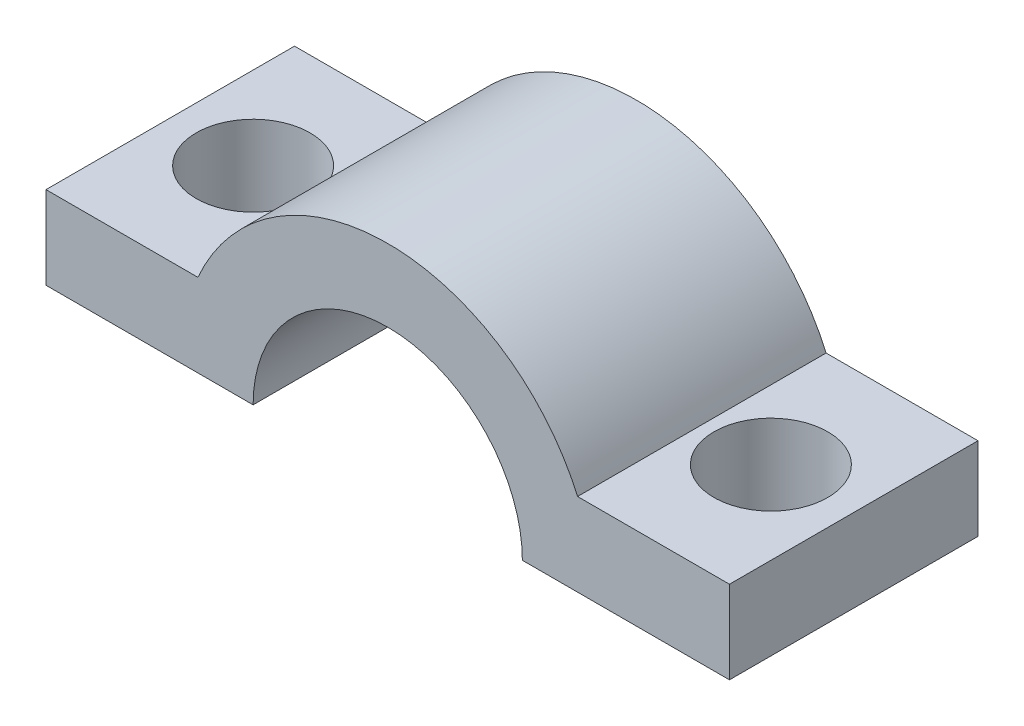
ISO-10303-21;
HEADER;
FILE_DESCRIPTION(('STEP AP214'),'2;1');
FILE_NAME('part.step','',(''),(''),'','','');
FILE_SCHEMA(('AUTOMOTIVE_DESIGN { 1 0 10303 214 1 1 1 1 }'));
ENDSEC;
DATA;
#1=APPLICATION_CONTEXT('core data for automotive mechanical design processes');
#2=APPLICATION_PROTOCOL_DEFINITION('international standard','automotive_design',2000,#1);
#3=PRODUCT_CONTEXT('',#1,'mechanical');
#4=PRODUCT('Part','Part','',(#3));
#5=PRODUCT_RELATED_PRODUCT_CATEGORY('part','',(#4));
#6=PRODUCT_DEFINITION_FORMATION('','',#4);
#7=PRODUCT_DEFINITION_CONTEXT('part definition',#1,'design');
#8=PRODUCT_DEFINITION('design','',#6,#7);
#9=PRODUCT_DEFINITION_SHAPE('','',#8);
#10=(LENGTH_UNIT() NAMED_UNIT(*) SI_UNIT(.MILLI.,.METRE.));
#11=(NAMED_UNIT(*) PLANE_ANGLE_UNIT() SI_UNIT($,.RADIAN.));
#12=(NAMED_UNIT(*) SI_UNIT($,.STERADIAN.) SOLID_ANGLE_UNIT());
#13=UNCERTAINTY_MEASURE_WITH_UNIT(LENGTH_MEASURE(1.E-05),#10,'distance_accuracy_value','');
#14=(GEOMETRIC_REPRESENTATION_CONTEXT(3) GLOBAL_UNCERTAINTY_ASSIGNED_CONTEXT((#13)) GLOBAL_UNIT_ASSIGNED_CONTEXT((#10,
#11,#12)) REPRESENTATION_CONTEXT('',''));
#15=CARTESIAN_POINT('',(0.,0.,0.));
#16=DIRECTION('',(0.,0.,1.));
#17=DIRECTION('',(1.,0.,0.));
#18=AXIS2_PLACEMENT_3D('',#15,#16,#17);
#19=CARTESIAN_POINT('',(0.,0.,12.));
#20=DIRECTION('',(0.,0.,-1.));
#21=DIRECTION('',(-1.,0.,0.));
#22=AXIS2_PLACEMENT_3D('',#19,#20,#21);
#23=CYLINDRICAL_SURFACE('',#22,13.);
#24=CARTESIAN_POINT('',(0.,0.,-12.));
#25=DIRECTION('',(0.,0.,-1.));
#26=DIRECTION('',(1.,0.,0.));
#27=AXIS2_PLACEMENT_3D('',#24,#25,#26);
#28=CIRCLE('',#27,13.);
#29=CARTESIAN_POINT('',(-13.,0.,-12.));
#30=VERTEX_POINT('',#29);
#31=CARTESIAN_POINT('',(13.,0.,-12.));
#32=VERTEX_POINT('',#31);
#33=EDGE_CURVE('E146',#30,#32,#28,.T.);
#34=ORIENTED_EDGE('',*,*,#33,.T.);
#35=DIRECTION('',(0.,0.,-1.));
#36=VECTOR('',#35,1.);
#37=CARTESIAN_POINT('',(13.,0.,12.));
#38=LINE('',#37,#36);
#39=CARTESIAN_POINT('',(13.,0.,12.));
#40=VERTEX_POINT('',#39);
#41=EDGE_CURVE('E11',#40,#32,#38,.T.);
#42=ORIENTED_EDGE('',*,*,#41,.F.);
#43=CARTESIAN_POINT('',(0.,0.,12.));
#44=DIRECTION('',(0.,0.,-1.));
#45=DIRECTION('',(1.,0.,0.));
#46=AXIS2_PLACEMENT_3D('',#43,#44,#45);
#47=CIRCLE('',#46,13.);
#48=CARTESIAN_POINT('',(-13.,0.,12.));
#49=VERTEX_POINT('',#48);
#50=EDGE_CURVE('E169',#49,#40,#47,.T.);
#51=ORIENTED_EDGE('',*,*,#50,.F.);
#52=DIRECTION('',(0.,0.,-1.));
#53=VECTOR('',#52,1.);
#54=CARTESIAN_POINT('',(-13.,0.,12.));
#55=LINE('',#54,#53);
#56=EDGE_CURVE('E142',#49,#30,#55,.T.);
#57=ORIENTED_EDGE('',*,*,#56,.T.);
#58=EDGE_LOOP('',(#34,#42,#51,#57));
#59=FACE_BOUND('',#58,.T.);
#60=ADVANCED_FACE('F45',(#59),#23,.F.);
#61=CARTESIAN_POINT('',(13.,0.,12.));
#62=DIRECTION('',(0.,1.,0.));
#63=DIRECTION('',(0.,0.,1.));
#64=AXIS2_PLACEMENT_3D('',#61,#62,#63);
#65=PLANE('',#64);
#66=CARTESIAN_POINT('',(25.,-4.38885039422132E-13,0.));
#67=DIRECTION('',(0.,1.,0.));
#68=DIRECTION('',(-1.,0.,0.));
#69=AXIS2_PLACEMENT_3D('',#66,#67,#68);
#70=CIRCLE('',#69,5.5);
#71=CARTESIAN_POINT('',(19.5,-3.97260276867116E-13,0.));
#72=VERTEX_POINT('',#71);
#73=EDGE_CURVE('E151',#72,#72,#70,.T.);
#74=ORIENTED_EDGE('',*,*,#73,.T.);
#75=EDGE_LOOP('',(#74));
#76=FACE_BOUND('',#75,.T.);
#77=DIRECTION('',(1.,0.,0.));
#78=VECTOR('',#77,1.);
#79=CARTESIAN_POINT('',(13.,0.,-12.));
#80=LINE('',#79,#78);
#81=CARTESIAN_POINT('',(33.,0.,-12.));
#82=VERTEX_POINT('',#81);
#83=EDGE_CURVE('E150',#32,#82,#80,.T.);
#84=ORIENTED_EDGE('',*,*,#83,.T.);
#85=DIRECTION('',(0.,0.,-1.));
#86=VECTOR('',#85,1.);
#87=CARTESIAN_POINT('',(33.,0.,12.));
#88=LINE('',#87,#86);
#89=CARTESIAN_POINT('',(33.,0.,12.));
#90=VERTEX_POINT('',#89);
#91=EDGE_CURVE('E54',#90,#82,#88,.T.);
#92=ORIENTED_EDGE('',*,*,#91,.F.);
#93=DIRECTION('',(1.,0.,0.));
#94=VECTOR('',#93,1.);
#95=CARTESIAN_POINT('',(13.,0.,12.));
#96=LINE('',#95,#94);
#97=EDGE_CURVE('E105',#40,#90,#96,.T.);
#98=ORIENTED_EDGE('',*,*,#97,.F.);
#99=ORIENTED_EDGE('',*,*,#41,.T.);
#100=EDGE_LOOP('',(#84,#92,#98,#99));
#101=FACE_BOUND('',#100,.T.);
#102=ADVANCED_FACE('F229',(#76,#101),#65,.F.);
#103=CARTESIAN_POINT('',(33.,0.,12.));
#104=DIRECTION('',(-1.,0.,0.));
#105=DIRECTION('',(0.,0.,1.));
#106=AXIS2_PLACEMENT_3D('',#103,#104,#105);
#107=PLANE('',#106);
#108=DIRECTION('',(0.,1.,0.));
#109=VECTOR('',#108,1.);
#110=CARTESIAN_POINT('',(33.,0.,-12.));
#111=LINE('',#110,#109);
#112=CARTESIAN_POINT('',(33.,8.,-12.));
#113=VERTEX_POINT('',#112);
#114=EDGE_CURVE('E154',#82,#113,#111,.T.);
#115=ORIENTED_EDGE('',*,*,#114,.T.);
#116=DIRECTION('',(0.,0.,-1.));
#117=VECTOR('',#116,1.);
#118=CARTESIAN_POINT('',(33.,8.,12.));
#119=LINE('',#118,#117);
#120=CARTESIAN_POINT('',(33.,8.,12.));
#121=VERTEX_POINT('',#120);
#122=EDGE_CURVE('E180',#121,#113,#119,.T.);
#123=ORIENTED_EDGE('',*,*,#122,.F.);
#124=DIRECTION('',(0.,1.,0.));
#125=VECTOR('',#124,1.);
#126=CARTESIAN_POINT('',(33.,0.,12.));
#127=LINE('',#126,#125);
#128=EDGE_CURVE('E190',#90,#121,#127,.T.);
#129=ORIENTED_EDGE('',*,*,#128,.F.);
#130=ORIENTED_EDGE('',*,*,#91,.T.);
#131=EDGE_LOOP('',(#115,#123,#129,#130));
#132=FACE_BOUND('',#131,.T.);
#133=ADVANCED_FACE('F188',(#132),#107,.F.);
#134=CARTESIAN_POINT('',(18.3303027798234,8.,12.));
#135=DIRECTION('',(0.,-1.,0.));
#136=DIRECTION('',(0.,0.,-1.));
#137=AXIS2_PLACEMENT_3D('',#134,#135,#136);
#138=PLANE('',#137);
#139=CARTESIAN_POINT('',(25.0000000000001,7.99999999999956,0.));
#140=DIRECTION('',(0.,1.,0.));
#141=DIRECTION('',(-1.,0.,0.));
#142=AXIS2_PLACEMENT_3D('',#139,#140,#141);
#143=CIRCLE('',#142,5.5);
#144=CARTESIAN_POINT('',(19.5000000000001,7.9999999999996,0.));
#145=VERTEX_POINT('',#144);
#146=EDGE_CURVE('E221',#145,#145,#143,.T.);
#147=ORIENTED_EDGE('',*,*,#146,.F.);
#148=EDGE_LOOP('',(#147));
#149=FACE_BOUND('',#148,.T.);
#150=DIRECTION('',(-1.,0.,0.));
#151=VECTOR('',#150,1.);
#152=CARTESIAN_POINT('',(18.3303027798234,8.,-12.));
#153=LINE('',#152,#151);
#154=CARTESIAN_POINT('',(18.3303027798234,8.,-12.));
#155=VERTEX_POINT('',#154);
#156=EDGE_CURVE('E157',#113,#155,#153,.T.);
#157=ORIENTED_EDGE('',*,*,#156,.T.);
#158=DIRECTION('',(0.,0.,-1.));
#159=VECTOR('',#158,1.);
#160=CARTESIAN_POINT('',(18.3303027798234,8.,12.));
#161=LINE('',#160,#159);
#162=CARTESIAN_POINT('',(18.3303027798234,8.,12.));
#163=VERTEX_POINT('',#162);
#164=EDGE_CURVE('E176',#163,#155,#161,.T.);
#165=ORIENTED_EDGE('',*,*,#164,.F.);
#166=DIRECTION('',(-1.,0.,0.));
#167=VECTOR('',#166,1.);
#168=CARTESIAN_POINT('',(18.3303027798234,8.,12.));
#169=LINE('',#168,#167);
#170=EDGE_CURVE('E203',#121,#163,#169,.T.);
#171=ORIENTED_EDGE('',*,*,#170,.F.);
#172=ORIENTED_EDGE('',*,*,#122,.T.);
#173=EDGE_LOOP('',(#157,#165,#171,#172));
#174=FACE_BOUND('',#173,.T.);
#175=ADVANCED_FACE('F198',(#149,#174),#138,.F.);
#176=CARTESIAN_POINT('',(0.,0.,12.));
#177=DIRECTION('',(0.,0.,-1.));
#178=DIRECTION('',(-1.,0.,0.));
#179=AXIS2_PLACEMENT_3D('',#176,#177,#178);
#180=CYLINDRICAL_SURFACE('',#179,20.);
#181=CARTESIAN_POINT('',(0.,0.,-12.));
#182=DIRECTION('',(0.,0.,1.));
#183=DIRECTION('',(1.,0.,0.));
#184=AXIS2_PLACEMENT_3D('',#181,#182,#183);
#185=CIRCLE('',#184,20.);
#186=CARTESIAN_POINT('',(-18.3303027798234,7.99999999999989,-12.));
#187=VERTEX_POINT('',#186);
#188=EDGE_CURVE('E160',#155,#187,#185,.T.);
#189=ORIENTED_EDGE('',*,*,#188,.T.);
#190=DIRECTION('',(0.,0.,-1.));
#191=VECTOR('',#190,1.);
#192=CARTESIAN_POINT('',(-18.3303027798234,7.99999999999989,12.));
#193=LINE('',#192,#191);
#194=CARTESIAN_POINT('',(-18.3303027798234,7.99999999999989,12.));
#195=VERTEX_POINT('',#194);
#196=EDGE_CURVE('E135',#195,#187,#193,.T.);
#197=ORIENTED_EDGE('',*,*,#196,.F.);
#198=CARTESIAN_POINT('',(0.,0.,12.));
#199=DIRECTION('',(0.,0.,1.));
#200=DIRECTION('',(1.,0.,0.));
#201=AXIS2_PLACEMENT_3D('',#198,#199,#200);
#202=CIRCLE('',#201,20.);
#203=EDGE_CURVE('E124',#163,#195,#202,.T.);
#204=ORIENTED_EDGE('',*,*,#203,.F.);
#205=ORIENTED_EDGE('',*,*,#164,.T.);
#206=EDGE_LOOP('',(#189,#197,#204,#205));
#207=FACE_BOUND('',#206,.T.);
#208=ADVANCED_FACE('F201',(#207),#180,.T.);
#209=CARTESIAN_POINT('',(-18.3303027798234,7.99999999999989,12.));
#210=DIRECTION('',(0.,-1.,0.));
#211=DIRECTION('',(1.,0.,0.));
#212=AXIS2_PLACEMENT_3D('',#209,#210,#211);
#213=PLANE('',#212);
#214=CARTESIAN_POINT('',(-24.9999999999999,7.99999999999994,0.));
#215=DIRECTION('',(0.,1.,0.));
#216=DIRECTION('',(1.,0.,0.));
#217=AXIS2_PLACEMENT_3D('',#214,#215,#216);
#218=CIRCLE('',#217,5.50000000000007);
#219=CARTESIAN_POINT('',(-19.4999999999999,7.9999999999999,0.));
#220=VERTEX_POINT('',#219);
#221=EDGE_CURVE('E217',#220,#220,#218,.T.);
#222=ORIENTED_EDGE('',*,*,#221,.F.);
#223=EDGE_LOOP('',(#222));
#224=FACE_BOUND('',#223,.T.);
#225=DIRECTION('',(-1.,0.,0.));
#226=VECTOR('',#225,1.);
#227=CARTESIAN_POINT('',(-18.3303027798234,7.99999999999989,-12.));
#228=LINE('',#227,#226);
#229=CARTESIAN_POINT('',(-33.,8.,-12.));
#230=VERTEX_POINT('',#229);
#231=EDGE_CURVE('E133',#187,#230,#228,.T.);
#232=ORIENTED_EDGE('',*,*,#231,.T.);
#233=DIRECTION('',(0.,0.,-1.));
#234=VECTOR('',#233,1.);
#235=CARTESIAN_POINT('',(-33.,8.,12.));
#236=LINE('',#235,#234);
#237=CARTESIAN_POINT('',(-33.,8.,12.));
#238=VERTEX_POINT('',#237);
#239=EDGE_CURVE('E130',#238,#230,#236,.T.);
#240=ORIENTED_EDGE('',*,*,#239,.F.);
#241=DIRECTION('',(-1.,0.,0.));
#242=VECTOR('',#241,1.);
#243=CARTESIAN_POINT('',(-18.3303027798234,7.99999999999989,12.));
#244=LINE('',#243,#242);
#245=EDGE_CURVE('E118',#195,#238,#244,.T.);
#246=ORIENTED_EDGE('',*,*,#245,.F.);
#247=ORIENTED_EDGE('',*,*,#196,.T.);
#248=EDGE_LOOP('',(#232,#240,#246,#247));
#249=FACE_BOUND('',#248,.T.);
#250=ADVANCED_FACE('F131',(#224,#249),#213,.F.);
#251=CARTESIAN_POINT('',(-33.,0.,12.));
#252=DIRECTION('',(1.,0.,0.));
#253=DIRECTION('',(0.,0.,-1.));
#254=AXIS2_PLACEMENT_3D('',#251,#252,#253);
#255=PLANE('',#254);
#256=DIRECTION('',(0.,-1.,0.));
#257=VECTOR('',#256,1.);
#258=CARTESIAN_POINT('',(-33.,0.,-12.));
#259=LINE('',#258,#257);
#260=CARTESIAN_POINT('',(-33.,0.,-12.));
#261=VERTEX_POINT('',#260);
#262=EDGE_CURVE('E91',#230,#261,#259,.T.);
#263=ORIENTED_EDGE('',*,*,#262,.T.);
#264=DIRECTION('',(0.,0.,-1.));
#265=VECTOR('',#264,1.);
#266=CARTESIAN_POINT('',(-33.,0.,12.));
#267=LINE('',#266,#265);
#268=CARTESIAN_POINT('',(-33.,0.,12.));
#269=VERTEX_POINT('',#268);
#270=EDGE_CURVE('E136',#269,#261,#267,.T.);
#271=ORIENTED_EDGE('',*,*,#270,.F.);
#272=DIRECTION('',(0.,-1.,0.));
#273=VECTOR('',#272,1.);
#274=CARTESIAN_POINT('',(-33.,0.,12.));
#275=LINE('',#274,#273);
#276=EDGE_CURVE('E122',#238,#269,#275,.T.);
#277=ORIENTED_EDGE('',*,*,#276,.F.);
#278=ORIENTED_EDGE('',*,*,#239,.T.);
#279=EDGE_LOOP('',(#263,#271,#277,#278));
#280=FACE_BOUND('',#279,.T.);
#281=ADVANCED_FACE('F138',(#280),#255,.F.);
#282=CARTESIAN_POINT('',(-13.,0.,12.));
#283=DIRECTION('',(0.,1.,0.));
#284=DIRECTION('',(0.,0.,1.));
#285=AXIS2_PLACEMENT_3D('',#282,#283,#284);
#286=PLANE('',#285);
#287=CARTESIAN_POINT('',(-25.,0.,0.));
#288=DIRECTION('',(0.,1.,0.));
#289=DIRECTION('',(1.,0.,0.));
#290=AXIS2_PLACEMENT_3D('',#287,#288,#289);
#291=CIRCLE('',#290,5.50000000000007);
#292=CARTESIAN_POINT('',(-19.4999999999999,-1.02340084214205E-13,0.));
#293=VERTEX_POINT('',#292);
#294=EDGE_CURVE('E213',#293,#293,#291,.T.);
#295=ORIENTED_EDGE('',*,*,#294,.T.);
#296=EDGE_LOOP('',(#295));
#297=FACE_BOUND('',#296,.T.);
#298=DIRECTION('',(1.,0.,0.));
#299=VECTOR('',#298,1.);
#300=CARTESIAN_POINT('',(-13.,0.,-12.));
#301=LINE('',#300,#299);
#302=EDGE_CURVE('E97',#261,#30,#301,.T.);
#303=ORIENTED_EDGE('',*,*,#302,.T.);
#304=ORIENTED_EDGE('',*,*,#56,.F.);
#305=DIRECTION('',(1.,0.,0.));
#306=VECTOR('',#305,1.);
#307=CARTESIAN_POINT('',(-13.,0.,12.));
#308=LINE('',#307,#306);
#309=EDGE_CURVE('E62',#269,#49,#308,.T.);
#310=ORIENTED_EDGE('',*,*,#309,.F.);
#311=ORIENTED_EDGE('',*,*,#270,.T.);
#312=EDGE_LOOP('',(#303,#304,#310,#311));
#313=FACE_BOUND('',#312,.T.);
#314=ADVANCED_FACE('F254',(#297,#313),#286,.F.);
#315=CARTESIAN_POINT('',(0.,0.,12.));
#316=DIRECTION('',(0.,0.,1.));
#317=DIRECTION('',(1.,0.,0.));
#318=AXIS2_PLACEMENT_3D('',#315,#316,#317);
#319=PLANE('',#318);
#320=ORIENTED_EDGE('',*,*,#50,.T.);
#321=ORIENTED_EDGE('',*,*,#97,.T.);
#322=ORIENTED_EDGE('',*,*,#128,.T.);
#323=ORIENTED_EDGE('',*,*,#170,.T.);
#324=ORIENTED_EDGE('',*,*,#203,.T.);
#325=ORIENTED_EDGE('',*,*,#245,.T.);
#326=ORIENTED_EDGE('',*,*,#276,.T.);
#327=ORIENTED_EDGE('',*,*,#309,.T.);
#328=EDGE_LOOP('',(#320,#321,#322,#323,#324,#325,#326,#327));
#329=FACE_BOUND('',#328,.T.);
#330=ADVANCED_FACE('F120',(#329),#319,.T.);
#331=CARTESIAN_POINT('',(0.,0.,-12.));
#332=DIRECTION('',(0.,0.,1.));
#333=DIRECTION('',(1.,0.,0.));
#334=AXIS2_PLACEMENT_3D('',#331,#332,#333);
#335=PLANE('',#334);
#336=ORIENTED_EDGE('',*,*,#33,.F.);
#337=ORIENTED_EDGE('',*,*,#302,.F.);
#338=ORIENTED_EDGE('',*,*,#262,.F.);
#339=ORIENTED_EDGE('',*,*,#231,.F.);
#340=ORIENTED_EDGE('',*,*,#188,.F.);
#341=ORIENTED_EDGE('',*,*,#156,.F.);
#342=ORIENTED_EDGE('',*,*,#114,.F.);
#343=ORIENTED_EDGE('',*,*,#83,.F.);
#344=EDGE_LOOP('',(#336,#337,#338,#339,#340,#341,#342,#343));
#345=FACE_BOUND('',#344,.T.);
#346=ADVANCED_FACE('F194',(#345),#335,.F.);
#347=CARTESIAN_POINT('',(-25.,0.,0.));
#348=DIRECTION('',(0.,1.,0.));
#349=DIRECTION('',(-1.,0.,0.));
#350=AXIS2_PLACEMENT_3D('',#347,#348,#349);
#351=CYLINDRICAL_SURFACE('',#350,5.50000000000007);
#352=ORIENTED_EDGE('',*,*,#294,.F.);
#353=EDGE_LOOP('',(#352));
#354=FACE_BOUND('',#353,.T.);
#355=ORIENTED_EDGE('',*,*,#221,.T.);
#356=EDGE_LOOP('',(#355));
#357=FACE_BOUND('',#356,.T.);
#358=ADVANCED_FACE('F234',(#354,#357),#351,.F.);
#359=CARTESIAN_POINT('',(25.,-4.38885039422132E-13,0.));
#360=DIRECTION('',(0.,1.,0.));
#361=DIRECTION('',(-1.,0.,0.));
#362=AXIS2_PLACEMENT_3D('',#359,#360,#361);
#363=CYLINDRICAL_SURFACE('',#362,5.5);
#364=ORIENTED_EDGE('',*,*,#73,.F.);
#365=EDGE_LOOP('',(#364));
#366=FACE_BOUND('',#365,.T.);
#367=ORIENTED_EDGE('',*,*,#146,.T.);
#368=EDGE_LOOP('',(#367));
#369=FACE_BOUND('',#368,.T.);
#370=ADVANCED_FACE('F231',(#366,#369),#363,.F.);
#371=CLOSED_SHELL('',(#60,#102,#133,#175,#208,#250,#281,#314,#330,#346,#358,#370));
#372=MANIFOLD_SOLID_BREP('B2',#371);
#373=ADVANCED_BREP_SHAPE_REPRESENTATION('',(#18,#372),#14);
#374=SHAPE_DEFINITION_REPRESENTATION(#9,#373);
ENDSEC;
END-ISO-10303-21;
